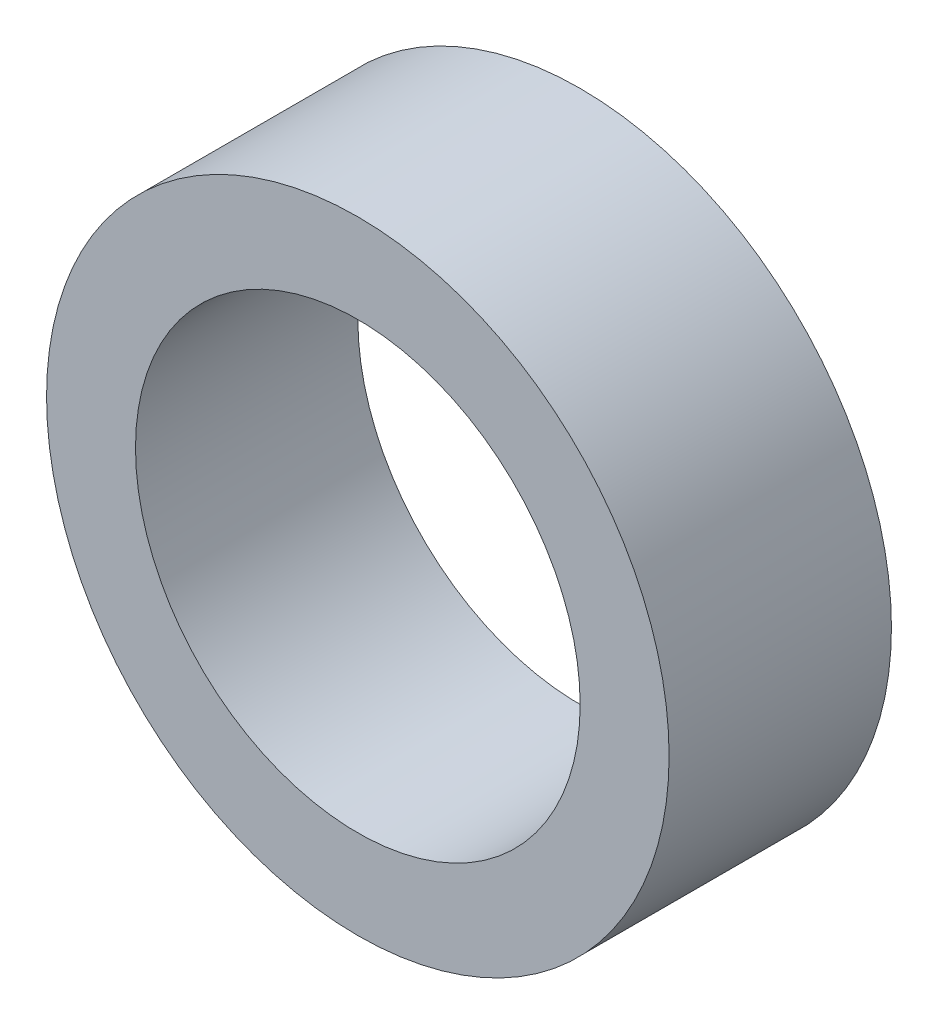
ISO-10303-21;
HEADER;
FILE_DESCRIPTION(('STEP AP214'),'2;1');
FILE_NAME('part.step','',(''),(''),'','','');
FILE_SCHEMA(('AUTOMOTIVE_DESIGN { 1 0 10303 214 1 1 1 1 }'));
ENDSEC;
DATA;
#1=APPLICATION_CONTEXT('core data for automotive mechanical design processes');
#2=APPLICATION_PROTOCOL_DEFINITION('international standard','automotive_design',2000,#1);
#3=PRODUCT_CONTEXT('',#1,'mechanical');
#4=PRODUCT('Part','Part','',(#3));
#5=PRODUCT_RELATED_PRODUCT_CATEGORY('part','',(#4));
#6=PRODUCT_DEFINITION_FORMATION('','',#4);
#7=PRODUCT_DEFINITION_CONTEXT('part definition',#1,'design');
#8=PRODUCT_DEFINITION('design','',#6,#7);
#9=PRODUCT_DEFINITION_SHAPE('','',#8);
#10=(LENGTH_UNIT() NAMED_UNIT(*) SI_UNIT(.MILLI.,.METRE.));
#11=(NAMED_UNIT(*) PLANE_ANGLE_UNIT() SI_UNIT($,.RADIAN.));
#12=(NAMED_UNIT(*) SI_UNIT($,.STERADIAN.) SOLID_ANGLE_UNIT());
#13=UNCERTAINTY_MEASURE_WITH_UNIT(LENGTH_MEASURE(1.E-05),#10,'distance_accuracy_value','');
#14=(GEOMETRIC_REPRESENTATION_CONTEXT(3) GLOBAL_UNCERTAINTY_ASSIGNED_CONTEXT((#13)) GLOBAL_UNIT_ASSIGNED_CONTEXT((#10,
#11,#12)) REPRESENTATION_CONTEXT('',''));
#15=CARTESIAN_POINT('',(0.,0.,0.));
#16=DIRECTION('',(0.,0.,1.));
#17=DIRECTION('',(1.,0.,0.));
#18=AXIS2_PLACEMENT_3D('',#15,#16,#17);
#19=CARTESIAN_POINT('',(0.,0.,2.5));
#20=DIRECTION('',(0.,0.,1.));
#21=DIRECTION('',(1.,0.,0.));
#22=AXIS2_PLACEMENT_3D('',#19,#20,#21);
#23=PLANE('',#22);
#24=CARTESIAN_POINT('',(0.,0.,2.5));
#25=DIRECTION('',(0.,0.,1.));
#26=DIRECTION('',(1.,0.,0.));
#27=AXIS2_PLACEMENT_3D('',#24,#25,#26);
#28=CIRCLE('',#27,3.5);
#29=CARTESIAN_POINT('',(3.5,0.,2.5));
#30=VERTEX_POINT('',#29);
#31=EDGE_CURVE('E10',#30,#30,#28,.T.);
#32=ORIENTED_EDGE('',*,*,#31,.T.);
#33=EDGE_LOOP('',(#32));
#34=FACE_BOUND('',#33,.T.);
#35=CARTESIAN_POINT('',(0.,0.,2.5));
#36=DIRECTION('',(0.,0.,1.));
#37=DIRECTION('',(1.,0.,0.));
#38=AXIS2_PLACEMENT_3D('',#35,#36,#37);
#39=CIRCLE('',#38,2.5);
#40=CARTESIAN_POINT('',(2.5,0.,2.5));
#41=VERTEX_POINT('',#40);
#42=EDGE_CURVE('E48',#41,#41,#39,.T.);
#43=ORIENTED_EDGE('',*,*,#42,.F.);
#44=EDGE_LOOP('',(#43));
#45=FACE_BOUND('',#44,.T.);
#46=ADVANCED_FACE('F37',(#34,#45),#23,.T.);
#47=CARTESIAN_POINT('',(0.,0.,0.));
#48=DIRECTION('',(0.,0.,1.));
#49=DIRECTION('',(1.,0.,0.));
#50=AXIS2_PLACEMENT_3D('',#47,#48,#49);
#51=PLANE('',#50);
#52=CARTESIAN_POINT('',(0.,0.,0.));
#53=DIRECTION('',(0.,0.,1.));
#54=DIRECTION('',(1.,0.,0.));
#55=AXIS2_PLACEMENT_3D('',#52,#53,#54);
#56=CIRCLE('',#55,3.5);
#57=CARTESIAN_POINT('',(3.5,0.,0.));
#58=VERTEX_POINT('',#57);
#59=EDGE_CURVE('E41',#58,#58,#56,.T.);
#60=ORIENTED_EDGE('',*,*,#59,.F.);
#61=EDGE_LOOP('',(#60));
#62=FACE_BOUND('',#61,.T.);
#63=CARTESIAN_POINT('',(0.,0.,0.));
#64=DIRECTION('',(0.,0.,1.));
#65=DIRECTION('',(1.,0.,0.));
#66=AXIS2_PLACEMENT_3D('',#63,#64,#65);
#67=CIRCLE('',#66,2.5);
#68=CARTESIAN_POINT('',(2.5,0.,0.));
#69=VERTEX_POINT('',#68);
#70=EDGE_CURVE('E50',#69,#69,#67,.T.);
#71=ORIENTED_EDGE('',*,*,#70,.T.);
#72=EDGE_LOOP('',(#71));
#73=FACE_BOUND('',#72,.T.);
#74=ADVANCED_FACE('F60',(#62,#73),#51,.F.);
#75=CARTESIAN_POINT('',(0.,0.,2.5));
#76=DIRECTION('',(0.,0.,-1.));
#77=DIRECTION('',(-1.,0.,0.));
#78=AXIS2_PLACEMENT_3D('',#75,#76,#77);
#79=CYLINDRICAL_SURFACE('',#78,3.5);
#80=ORIENTED_EDGE('',*,*,#31,.F.);
#81=EDGE_LOOP('',(#80));
#82=FACE_BOUND('',#81,.T.);
#83=ORIENTED_EDGE('',*,*,#59,.T.);
#84=EDGE_LOOP('',(#83));
#85=FACE_BOUND('',#84,.T.);
#86=ADVANCED_FACE('F39',(#82,#85),#79,.T.);
#87=CARTESIAN_POINT('',(0.,0.,2.5));
#88=DIRECTION('',(0.,0.,-1.));
#89=DIRECTION('',(-1.,0.,0.));
#90=AXIS2_PLACEMENT_3D('',#87,#88,#89);
#91=CYLINDRICAL_SURFACE('',#90,2.5);
#92=ORIENTED_EDGE('',*,*,#42,.T.);
#93=EDGE_LOOP('',(#92));
#94=FACE_BOUND('',#93,.T.);
#95=ORIENTED_EDGE('',*,*,#70,.F.);
#96=EDGE_LOOP('',(#95));
#97=FACE_BOUND('',#96,.T.);
#98=ADVANCED_FACE('F56',(#94,#97),#91,.F.);
#99=CLOSED_SHELL('',(#46,#74,#86,#98));
#100=MANIFOLD_SOLID_BREP('B2',#99);
#101=ADVANCED_BREP_SHAPE_REPRESENTATION('',(#18,#100),#14);
#102=SHAPE_DEFINITION_REPRESENTATION(#9,#101);
ENDSEC;
END-ISO-10303-21;
